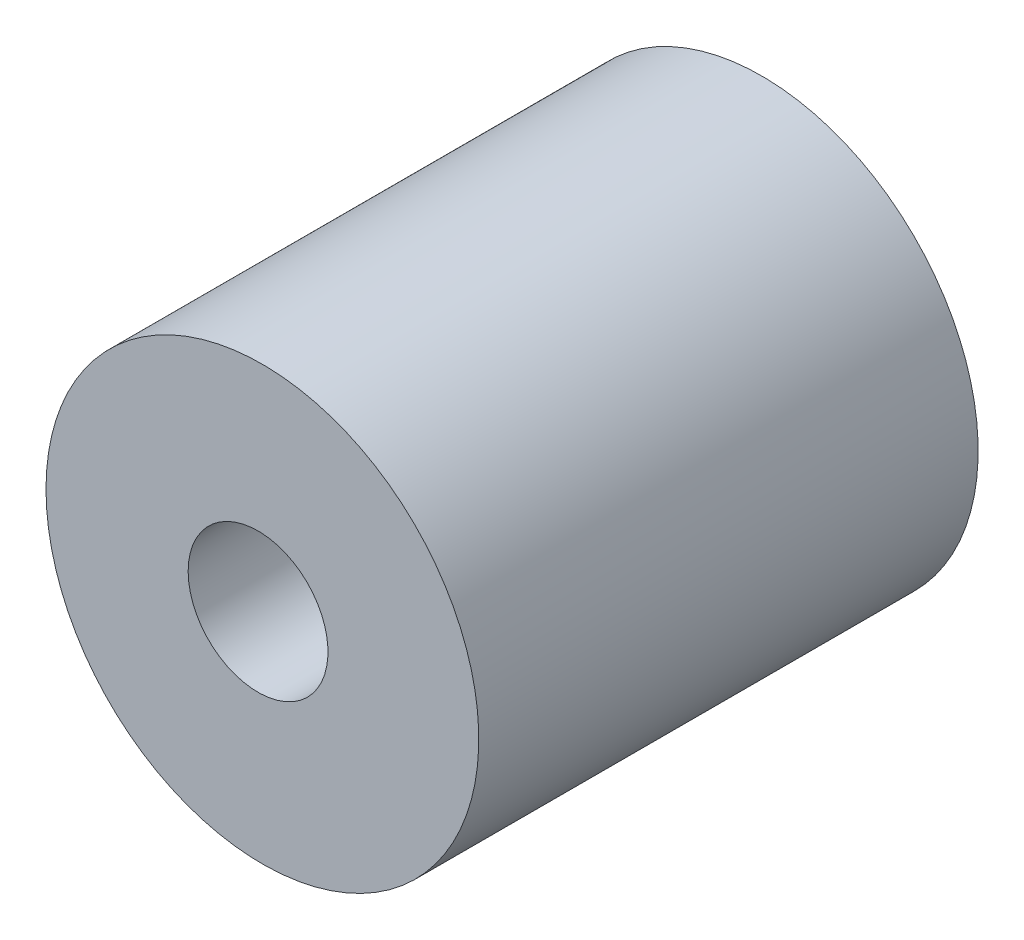
ISO-10303-21;
HEADER;
FILE_DESCRIPTION(('STEP AP214'),'2;1');
FILE_NAME('part.step','',(''),(''),'','','');
FILE_SCHEMA(('AUTOMOTIVE_DESIGN { 1 0 10303 214 1 1 1 1 }'));
ENDSEC;
DATA;
#1=APPLICATION_CONTEXT('core data for automotive mechanical design processes');
#2=APPLICATION_PROTOCOL_DEFINITION('international standard','automotive_design',2000,#1);
#3=PRODUCT_CONTEXT('',#1,'mechanical');
#4=PRODUCT('Part','Part','',(#3));
#5=PRODUCT_RELATED_PRODUCT_CATEGORY('part','',(#4));
#6=PRODUCT_DEFINITION_FORMATION('','',#4);
#7=PRODUCT_DEFINITION_CONTEXT('part definition',#1,'design');
#8=PRODUCT_DEFINITION('design','',#6,#7);
#9=PRODUCT_DEFINITION_SHAPE('','',#8);
#10=(LENGTH_UNIT() NAMED_UNIT(*) SI_UNIT(.MILLI.,.METRE.));
#11=(NAMED_UNIT(*) PLANE_ANGLE_UNIT() SI_UNIT($,.RADIAN.));
#12=(NAMED_UNIT(*) SI_UNIT($,.STERADIAN.) SOLID_ANGLE_UNIT());
#13=UNCERTAINTY_MEASURE_WITH_UNIT(LENGTH_MEASURE(1.E-05),#10,'distance_accuracy_value','');
#14=(GEOMETRIC_REPRESENTATION_CONTEXT(3) GLOBAL_UNCERTAINTY_ASSIGNED_CONTEXT((#13)) GLOBAL_UNIT_ASSIGNED_CONTEXT((#10,
#11,#12)) REPRESENTATION_CONTEXT('',''));
#15=CARTESIAN_POINT('',(0.,0.,0.));
#16=DIRECTION('',(0.,0.,1.));
#17=DIRECTION('',(1.,0.,0.));
#18=AXIS2_PLACEMENT_3D('',#15,#16,#17);
#19=CARTESIAN_POINT('',(0.165429311437038,0.,19.05));
#20=DIRECTION('',(0.,0.,1.));
#21=DIRECTION('',(1.,0.,0.));
#22=AXIS2_PLACEMENT_3D('',#19,#20,#21);
#23=PLANE('',#22);
#24=CARTESIAN_POINT('',(0.165429311437038,0.,19.05));
#25=DIRECTION('',(0.,0.,1.));
#26=DIRECTION('',(1.,0.,0.));
#27=AXIS2_PLACEMENT_3D('',#24,#25,#26);
#28=CIRCLE('',#27,8.255);
#29=CARTESIAN_POINT('',(-8.08957068856296,0.,19.05));
#30=VERTEX_POINT('',#29);
#31=EDGE_CURVE('E10',#30,#30,#28,.T.);
#32=ORIENTED_EDGE('',*,*,#31,.T.);
#33=EDGE_LOOP('',(#32));
#34=FACE_BOUND('',#33,.T.);
#35=CARTESIAN_POINT('',(0.,0.,19.05));
#36=DIRECTION('',(0.,0.,1.));
#37=DIRECTION('',(1.,0.,0.));
#38=AXIS2_PLACEMENT_3D('',#35,#36,#37);
#39=CIRCLE('',#38,2.667);
#40=CARTESIAN_POINT('',(-2.667,0.,19.05));
#41=VERTEX_POINT('',#40);
#42=EDGE_CURVE('E46',#41,#41,#39,.T.);
#43=ORIENTED_EDGE('',*,*,#42,.F.);
#44=EDGE_LOOP('',(#43));
#45=FACE_BOUND('',#44,.T.);
#46=ADVANCED_FACE('F35',(#34,#45),#23,.T.);
#47=CARTESIAN_POINT('',(0.165429311437038,0.,0.));
#48=DIRECTION('',(0.,0.,1.));
#49=DIRECTION('',(1.,0.,0.));
#50=AXIS2_PLACEMENT_3D('',#47,#48,#49);
#51=PLANE('',#50);
#52=CARTESIAN_POINT('',(0.165429311437038,0.,0.));
#53=DIRECTION('',(0.,0.,1.));
#54=DIRECTION('',(1.,0.,0.));
#55=AXIS2_PLACEMENT_3D('',#52,#53,#54);
#56=CIRCLE('',#55,8.255);
#57=CARTESIAN_POINT('',(-8.08957068856296,0.,0.));
#58=VERTEX_POINT('',#57);
#59=EDGE_CURVE('E39',#58,#58,#56,.T.);
#60=ORIENTED_EDGE('',*,*,#59,.F.);
#61=EDGE_LOOP('',(#60));
#62=FACE_BOUND('',#61,.T.);
#63=CARTESIAN_POINT('',(0.,0.,0.));
#64=DIRECTION('',(0.,0.,1.));
#65=DIRECTION('',(1.,0.,0.));
#66=AXIS2_PLACEMENT_3D('',#63,#64,#65);
#67=CIRCLE('',#66,2.667);
#68=CARTESIAN_POINT('',(-2.667,0.,0.));
#69=VERTEX_POINT('',#68);
#70=EDGE_CURVE('E48',#69,#69,#67,.T.);
#71=ORIENTED_EDGE('',*,*,#70,.T.);
#72=EDGE_LOOP('',(#71));
#73=FACE_BOUND('',#72,.T.);
#74=ADVANCED_FACE('F58',(#62,#73),#51,.F.);
#75=CARTESIAN_POINT('',(0.165429311437038,0.,19.05));
#76=DIRECTION('',(0.,0.,-1.));
#77=DIRECTION('',(-1.,0.,0.));
#78=AXIS2_PLACEMENT_3D('',#75,#76,#77);
#79=CYLINDRICAL_SURFACE('',#78,8.255);
#80=CARTESIAN_POINT('',(-8.08957068856296,0.,19.05));
#81=CARTESIAN_POINT('',(-8.08957068856296,0.,18.8515625));
#82=CARTESIAN_POINT('',(-8.08957068856296,0.,18.653125));
#83=CARTESIAN_POINT('',(-8.08957068856296,0.,18.25625));
#84=CARTESIAN_POINT('',(-8.08957068856296,0.,18.0578125));
#85=CARTESIAN_POINT('',(-8.08957068856296,0.,17.6609375));
#86=CARTESIAN_POINT('',(-8.08957068856296,0.,17.4625));
#87=CARTESIAN_POINT('',(-8.08957068856296,0.,17.065625));
#88=CARTESIAN_POINT('',(-8.08957068856296,0.,16.8671875));
#89=CARTESIAN_POINT('',(-8.08957068856296,0.,16.4703125));
#90=CARTESIAN_POINT('',(-8.08957068856296,0.,16.271875));
#91=CARTESIAN_POINT('',(-8.08957068856296,0.,15.875));
#92=CARTESIAN_POINT('',(-8.08957068856296,0.,15.6765625));
#93=CARTESIAN_POINT('',(-8.08957068856296,0.,15.2796875));
#94=CARTESIAN_POINT('',(-8.08957068856296,0.,15.08125));
#95=CARTESIAN_POINT('',(-8.08957068856296,0.,14.684375));
#96=CARTESIAN_POINT('',(-8.08957068856296,0.,14.4859375));
#97=CARTESIAN_POINT('',(-8.08957068856296,0.,14.0890625));
#98=CARTESIAN_POINT('',(-8.08957068856296,0.,13.890625));
#99=CARTESIAN_POINT('',(-8.08957068856296,0.,13.49375));
#100=CARTESIAN_POINT('',(-8.08957068856296,0.,13.2953125));
#101=CARTESIAN_POINT('',(-8.08957068856296,0.,12.8984375));
#102=CARTESIAN_POINT('',(-8.08957068856296,0.,12.7));
#103=CARTESIAN_POINT('',(-8.08957068856296,0.,12.303125));
#104=CARTESIAN_POINT('',(-8.08957068856296,0.,12.1046875));
#105=CARTESIAN_POINT('',(-8.08957068856296,0.,11.7078125));
#106=CARTESIAN_POINT('',(-8.08957068856296,0.,11.509375));
#107=CARTESIAN_POINT('',(-8.08957068856296,0.,11.1125));
#108=CARTESIAN_POINT('',(-8.08957068856296,0.,10.9140625));
#109=CARTESIAN_POINT('',(-8.08957068856296,0.,10.5171875));
#110=CARTESIAN_POINT('',(-8.08957068856296,0.,10.31875));
#111=CARTESIAN_POINT('',(-8.08957068856296,0.,9.921875));
#112=CARTESIAN_POINT('',(-8.08957068856296,0.,9.7234375));
#113=CARTESIAN_POINT('',(-8.08957068856296,0.,9.3265625));
#114=CARTESIAN_POINT('',(-8.08957068856296,0.,9.128125));
#115=CARTESIAN_POINT('',(-8.08957068856296,0.,8.73125));
#116=CARTESIAN_POINT('',(-8.08957068856296,0.,8.5328125));
#117=CARTESIAN_POINT('',(-8.08957068856296,0.,8.1359375));
#118=CARTESIAN_POINT('',(-8.08957068856296,0.,7.9375));
#119=CARTESIAN_POINT('',(-8.08957068856296,0.,7.540625));
#120=CARTESIAN_POINT('',(-8.08957068856296,0.,7.3421875));
#121=CARTESIAN_POINT('',(-8.08957068856296,0.,6.9453125));
#122=CARTESIAN_POINT('',(-8.08957068856296,0.,6.746875));
#123=CARTESIAN_POINT('',(-8.08957068856296,0.,6.35));
#124=CARTESIAN_POINT('',(-8.08957068856296,0.,6.1515625));
#125=CARTESIAN_POINT('',(-8.08957068856296,0.,5.7546875));
#126=CARTESIAN_POINT('',(-8.08957068856296,0.,5.55625));
#127=CARTESIAN_POINT('',(-8.08957068856296,0.,5.159375));
#128=CARTESIAN_POINT('',(-8.08957068856296,0.,4.9609375));
#129=CARTESIAN_POINT('',(-8.08957068856296,0.,4.5640625));
#130=CARTESIAN_POINT('',(-8.08957068856296,0.,4.365625));
#131=CARTESIAN_POINT('',(-8.08957068856296,0.,3.96875));
#132=CARTESIAN_POINT('',(-8.08957068856296,0.,3.7703125));
#133=CARTESIAN_POINT('',(-8.08957068856296,0.,3.3734375));
#134=CARTESIAN_POINT('',(-8.08957068856296,0.,3.175));
#135=CARTESIAN_POINT('',(-8.08957068856296,0.,2.778125));
#136=CARTESIAN_POINT('',(-8.08957068856296,0.,2.5796875));
#137=CARTESIAN_POINT('',(-8.08957068856296,0.,2.1828125));
#138=CARTESIAN_POINT('',(-8.08957068856296,0.,1.984375));
#139=CARTESIAN_POINT('',(-8.08957068856296,0.,1.5875));
#140=CARTESIAN_POINT('',(-8.08957068856296,0.,1.3890625));
#141=CARTESIAN_POINT('',(-8.08957068856296,0.,0.992187500000001));
#142=CARTESIAN_POINT('',(-8.08957068856296,0.,0.793750000000001));
#143=CARTESIAN_POINT('',(-8.08957068856296,0.,0.396875));
#144=CARTESIAN_POINT('',(-8.08957068856296,0.,0.1984375));
#145=CARTESIAN_POINT('',(-8.08957068856296,0.,0.));
#146=B_SPLINE_CURVE_WITH_KNOTS('',3,(#80,#81,#82,#83,#84,#85,#86,#87,#88,#89,#90,#91,#92,#93,
#94,#95,#96,#97,#98,#99,#100,#101,#102,#103,#104,#105,#106,#107,#108,#109,#110,#111,#112,#113,
#114,#115,#116,#117,#118,#119,#120,#121,#122,#123,#124,#125,#126,#127,#128,#129,#130,#131,#132,
#133,#134,#135,#136,#137,#138,#139,#140,#141,#142,#143,#144,#145),.UNSPECIFIED.,.F.,.F.,(4,2,2,
2,2,2,2,2,2,2,2,2,2,2,2,2,2,2,2,2,2,2,2,2,2,2,2,2,2,2,2,2,4),(0.,0.5953125,1.190625,1.7859375,
2.38125,2.9765625,3.571875,4.1671875,4.7625,5.3578125,5.953125,6.5484375,7.14375,7.7390625,
8.334375,8.9296875,9.525,10.1203125,10.715625,11.3109375,11.90625,12.5015625,13.096875,
13.6921875,14.2875,14.8828125,15.478125,16.0734375,16.66875,17.2640625,17.859375,18.4546875,
19.05),.UNSPECIFIED.);
#147=EDGE_CURVE('BSEAM37',#30,#58,#146,.T.);
#148=ORIENTED_EDGE('',*,*,#31,.F.);
#149=ORIENTED_EDGE('',*,*,#59,.T.);
#150=ORIENTED_EDGE('',*,*,#147,.T.);
#151=ORIENTED_EDGE('',*,*,#147,.F.);
#152=EDGE_LOOP('',(#148,#150,#149,#151));
#153=FACE_BOUND('',#152,.T.);
#154=ADVANCED_FACE('F37',(#153),#79,.T.);
#155=CARTESIAN_POINT('',(0.,0.,19.05));
#156=DIRECTION('',(0.,0.,-1.));
#157=DIRECTION('',(-1.,0.,0.));
#158=AXIS2_PLACEMENT_3D('',#155,#156,#157);
#159=CYLINDRICAL_SURFACE('',#158,2.667);
#160=CARTESIAN_POINT('',(-2.667,0.,19.05));
#161=CARTESIAN_POINT('',(-2.667,0.,18.8515625));
#162=CARTESIAN_POINT('',(-2.667,0.,18.653125));
#163=CARTESIAN_POINT('',(-2.667,0.,18.25625));
#164=CARTESIAN_POINT('',(-2.667,0.,18.0578125));
#165=CARTESIAN_POINT('',(-2.667,0.,17.6609375));
#166=CARTESIAN_POINT('',(-2.667,0.,17.4625));
#167=CARTESIAN_POINT('',(-2.667,0.,17.065625));
#168=CARTESIAN_POINT('',(-2.667,0.,16.8671875));
#169=CARTESIAN_POINT('',(-2.667,0.,16.4703125));
#170=CARTESIAN_POINT('',(-2.667,0.,16.271875));
#171=CARTESIAN_POINT('',(-2.667,0.,15.875));
#172=CARTESIAN_POINT('',(-2.667,0.,15.6765625));
#173=CARTESIAN_POINT('',(-2.667,0.,15.2796875));
#174=CARTESIAN_POINT('',(-2.667,0.,15.08125));
#175=CARTESIAN_POINT('',(-2.667,0.,14.684375));
#176=CARTESIAN_POINT('',(-2.667,0.,14.4859375));
#177=CARTESIAN_POINT('',(-2.667,0.,14.0890625));
#178=CARTESIAN_POINT('',(-2.667,0.,13.890625));
#179=CARTESIAN_POINT('',(-2.667,0.,13.49375));
#180=CARTESIAN_POINT('',(-2.667,0.,13.2953125));
#181=CARTESIAN_POINT('',(-2.667,0.,12.8984375));
#182=CARTESIAN_POINT('',(-2.667,0.,12.7));
#183=CARTESIAN_POINT('',(-2.667,0.,12.303125));
#184=CARTESIAN_POINT('',(-2.667,0.,12.1046875));
#185=CARTESIAN_POINT('',(-2.667,0.,11.7078125));
#186=CARTESIAN_POINT('',(-2.667,0.,11.509375));
#187=CARTESIAN_POINT('',(-2.667,0.,11.1125));
#188=CARTESIAN_POINT('',(-2.667,0.,10.9140625));
#189=CARTESIAN_POINT('',(-2.667,0.,10.5171875));
#190=CARTESIAN_POINT('',(-2.667,0.,10.31875));
#191=CARTESIAN_POINT('',(-2.667,0.,9.921875));
#192=CARTESIAN_POINT('',(-2.667,0.,9.7234375));
#193=CARTESIAN_POINT('',(-2.667,0.,9.3265625));
#194=CARTESIAN_POINT('',(-2.667,0.,9.128125));
#195=CARTESIAN_POINT('',(-2.667,0.,8.73125));
#196=CARTESIAN_POINT('',(-2.667,0.,8.5328125));
#197=CARTESIAN_POINT('',(-2.667,0.,8.1359375));
#198=CARTESIAN_POINT('',(-2.667,0.,7.9375));
#199=CARTESIAN_POINT('',(-2.667,0.,7.540625));
#200=CARTESIAN_POINT('',(-2.667,0.,7.3421875));
#201=CARTESIAN_POINT('',(-2.667,0.,6.9453125));
#202=CARTESIAN_POINT('',(-2.667,0.,6.746875));
#203=CARTESIAN_POINT('',(-2.667,0.,6.35));
#204=CARTESIAN_POINT('',(-2.667,0.,6.1515625));
#205=CARTESIAN_POINT('',(-2.667,0.,5.7546875));
#206=CARTESIAN_POINT('',(-2.667,0.,5.55625));
#207=CARTESIAN_POINT('',(-2.667,0.,5.159375));
#208=CARTESIAN_POINT('',(-2.667,0.,4.9609375));
#209=CARTESIAN_POINT('',(-2.667,0.,4.5640625));
#210=CARTESIAN_POINT('',(-2.667,0.,4.365625));
#211=CARTESIAN_POINT('',(-2.667,0.,3.96875));
#212=CARTESIAN_POINT('',(-2.667,0.,3.7703125));
#213=CARTESIAN_POINT('',(-2.667,0.,3.3734375));
#214=CARTESIAN_POINT('',(-2.667,0.,3.175));
#215=CARTESIAN_POINT('',(-2.667,0.,2.778125));
#216=CARTESIAN_POINT('',(-2.667,0.,2.5796875));
#217=CARTESIAN_POINT('',(-2.667,0.,2.1828125));
#218=CARTESIAN_POINT('',(-2.667,0.,1.984375));
#219=CARTESIAN_POINT('',(-2.667,0.,1.5875));
#220=CARTESIAN_POINT('',(-2.667,0.,1.3890625));
#221=CARTESIAN_POINT('',(-2.667,0.,0.992187500000001));
#222=CARTESIAN_POINT('',(-2.667,0.,0.793750000000001));
#223=CARTESIAN_POINT('',(-2.667,0.,0.396875));
#224=CARTESIAN_POINT('',(-2.667,0.,0.1984375));
#225=CARTESIAN_POINT('',(-2.667,0.,0.));
#226=B_SPLINE_CURVE_WITH_KNOTS('',3,(#160,#161,#162,#163,#164,#165,#166,#167,#168,#169,#170,
#171,#172,#173,#174,#175,#176,#177,#178,#179,#180,#181,#182,#183,#184,#185,#186,#187,#188,#189,
#190,#191,#192,#193,#194,#195,#196,#197,#198,#199,#200,#201,#202,#203,#204,#205,#206,#207,#208,
#209,#210,#211,#212,#213,#214,#215,#216,#217,#218,#219,#220,#221,#222,#223,#224,#225),
.UNSPECIFIED.,.F.,.F.,(4,2,2,2,2,2,2,2,2,2,2,2,2,2,2,2,2,2,2,2,2,2,2,2,2,2,2,2,2,2,2,2,4),(0.,
0.5953125,1.190625,1.7859375,2.38125,2.9765625,3.571875,4.1671875,4.7625,5.3578125,5.953125,
6.5484375,7.14375,7.7390625,8.334375,8.9296875,9.525,10.1203125,10.715625,11.3109375,11.90625,
12.5015625,13.096875,13.6921875,14.2875,14.8828125,15.478125,16.0734375,16.66875,17.2640625,
17.859375,18.4546875,19.05),.UNSPECIFIED.);
#227=EDGE_CURVE('BSEAM54',#41,#69,#226,.T.);
#228=ORIENTED_EDGE('',*,*,#42,.T.);
#229=ORIENTED_EDGE('',*,*,#70,.F.);
#230=ORIENTED_EDGE('',*,*,#227,.T.);
#231=ORIENTED_EDGE('',*,*,#227,.F.);
#232=EDGE_LOOP('',(#228,#230,#229,#231));
#233=FACE_BOUND('',#232,.T.);
#234=ADVANCED_FACE('F54',(#233),#159,.F.);
#235=CLOSED_SHELL('',(#46,#74,#154,#234));
#236=MANIFOLD_SOLID_BREP('B2',#235);
#237=ADVANCED_BREP_SHAPE_REPRESENTATION('',(#18,#236),#14);
#238=SHAPE_DEFINITION_REPRESENTATION(#9,#237);
ENDSEC;
END-ISO-10303-21;
